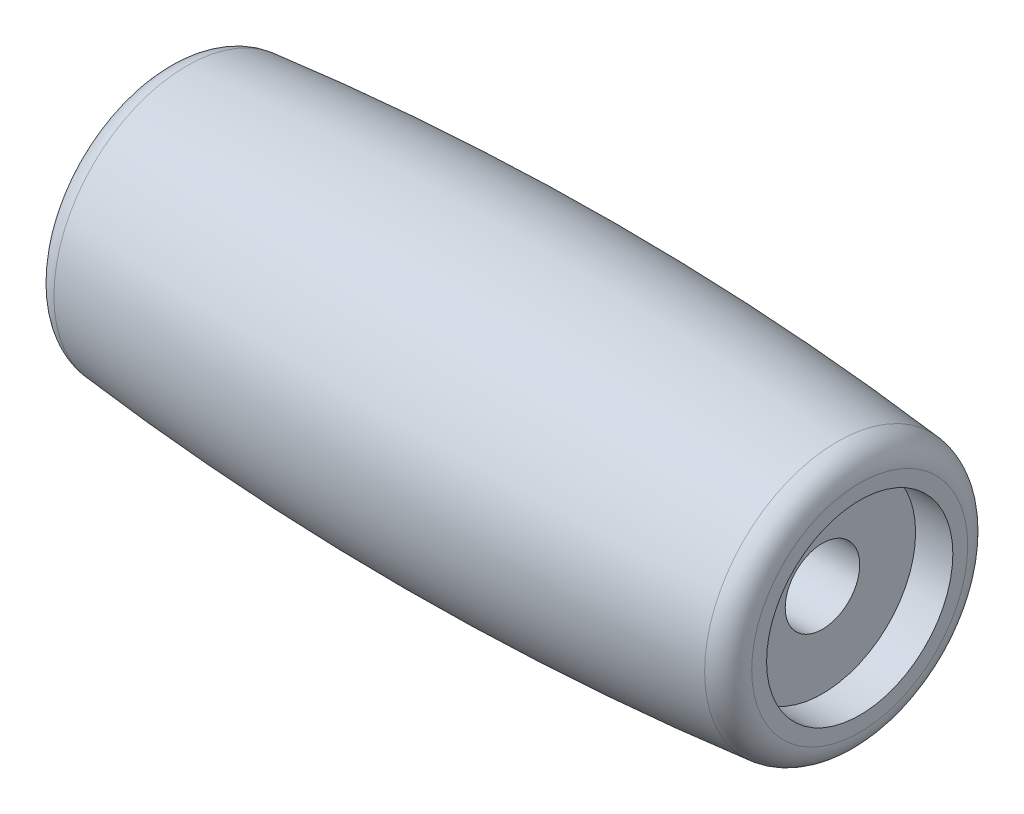
ISO-10303-21;
HEADER;
FILE_DESCRIPTION(('STEP AP214'),'2;1');
FILE_NAME('part.step','',(''),(''),'','','');
FILE_SCHEMA(('AUTOMOTIVE_DESIGN { 1 0 10303 214 1 1 1 1 }'));
ENDSEC;
DATA;
#1=APPLICATION_CONTEXT('core data for automotive mechanical design processes');
#2=APPLICATION_PROTOCOL_DEFINITION('international standard','automotive_design',2000,#1);
#3=PRODUCT_CONTEXT('',#1,'mechanical');
#4=PRODUCT('Part','Part','',(#3));
#5=PRODUCT_RELATED_PRODUCT_CATEGORY('part','',(#4));
#6=PRODUCT_DEFINITION_FORMATION('','',#4);
#7=PRODUCT_DEFINITION_CONTEXT('part definition',#1,'design');
#8=PRODUCT_DEFINITION('design','',#6,#7);
#9=PRODUCT_DEFINITION_SHAPE('','',#8);
#10=(LENGTH_UNIT() NAMED_UNIT(*) SI_UNIT(.MILLI.,.METRE.));
#11=(NAMED_UNIT(*) PLANE_ANGLE_UNIT() SI_UNIT($,.RADIAN.));
#12=(NAMED_UNIT(*) SI_UNIT($,.STERADIAN.) SOLID_ANGLE_UNIT());
#13=UNCERTAINTY_MEASURE_WITH_UNIT(LENGTH_MEASURE(1.E-05),#10,'distance_accuracy_value','');
#14=(GEOMETRIC_REPRESENTATION_CONTEXT(3) GLOBAL_UNCERTAINTY_ASSIGNED_CONTEXT((#13)) GLOBAL_UNIT_ASSIGNED_CONTEXT((#10,
#11,#12)) REPRESENTATION_CONTEXT('',''));
#15=CARTESIAN_POINT('',(0.,0.,0.));
#16=DIRECTION('',(0.,0.,1.));
#17=DIRECTION('',(1.,0.,0.));
#18=AXIS2_PLACEMENT_3D('',#15,#16,#17);
#19=CARTESIAN_POINT('',(-14.,3.75,0.));
#20=DIRECTION('',(1.,0.,0.));
#21=DIRECTION('',(0.,0.,-1.));
#22=AXIS2_PLACEMENT_3D('',#19,#20,#21);
#23=PLANE('',#22);
#24=CARTESIAN_POINT('',(-14.,0.,0.));
#25=DIRECTION('',(1.,0.,0.));
#26=DIRECTION('',(0.,0.,-1.));
#27=AXIS2_PLACEMENT_3D('',#24,#25,#26);
#28=CIRCLE('',#27,4.34857666506389);
#29=CARTESIAN_POINT('',(-14.,0.,-4.34857666506389));
#30=VERTEX_POINT('',#29);
#31=EDGE_CURVE('E10',#30,#30,#28,.F.);
#32=ORIENTED_EDGE('',*,*,#31,.T.);
#33=EDGE_LOOP('',(#32));
#34=FACE_BOUND('',#33,.T.);
#35=CARTESIAN_POINT('',(-14.,0.,0.));
#36=DIRECTION('',(-1.,0.,0.));
#37=DIRECTION('',(0.,0.,1.));
#38=AXIS2_PLACEMENT_3D('',#35,#36,#37);
#39=CIRCLE('',#38,3.75);
#40=CARTESIAN_POINT('',(-14.,0.,3.75));
#41=VERTEX_POINT('',#40);
#42=EDGE_CURVE('E76',#41,#41,#39,.T.);
#43=ORIENTED_EDGE('',*,*,#42,.F.);
#44=EDGE_LOOP('',(#43));
#45=FACE_BOUND('',#44,.T.);
#46=ADVANCED_FACE('F41',(#34,#45),#23,.F.);
#47=CARTESIAN_POINT('',(0.,0.,0.));
#48=DIRECTION('',(-1.,0.,0.));
#49=DIRECTION('',(0.,0.,1.));
#50=AXIS2_PLACEMENT_3D('',#47,#48,#49);
#51=DEGENERATE_TOROIDAL_SURFACE('',#50,125.041666666667,131.041666666667,.F.);
#52=CARTESIAN_POINT('',(13.0999679589875,0.,0.));
#53=DIRECTION('',(-1.,0.,0.));
#54=DIRECTION('',(0.,0.,1.));
#55=AXIS2_PLACEMENT_3D('',#52,#53,#54);
#56=CIRCLE('',#55,5.34356732189233);
#57=CARTESIAN_POINT('',(13.0999679589875,0.,5.34356732189233));
#58=VERTEX_POINT('',#57);
#59=EDGE_CURVE('E52',#58,#58,#56,.T.);
#60=ORIENTED_EDGE('',*,*,#59,.T.);
#61=EDGE_LOOP('',(#60));
#62=FACE_BOUND('',#61,.T.);
#63=CARTESIAN_POINT('',(-13.0999679589875,0.,0.));
#64=DIRECTION('',(1.,0.,0.));
#65=DIRECTION('',(0.,0.,-1.));
#66=AXIS2_PLACEMENT_3D('',#63,#64,#65);
#67=CIRCLE('',#66,5.34356732189233);
#68=CARTESIAN_POINT('',(-13.0999679589875,0.,-5.34356732189233));
#69=VERTEX_POINT('',#68);
#70=EDGE_CURVE('E56',#69,#69,#67,.T.);
#71=ORIENTED_EDGE('',*,*,#70,.T.);
#72=EDGE_LOOP('',(#71));
#73=FACE_BOUND('',#72,.T.);
#74=ADVANCED_FACE('F83',(#62,#73),#51,.F.);
#75=CARTESIAN_POINT('',(14.,3.75,0.));
#76=DIRECTION('',(-1.,0.,0.));
#77=DIRECTION('',(0.,0.,1.));
#78=AXIS2_PLACEMENT_3D('',#75,#76,#77);
#79=PLANE('',#78);
#80=CARTESIAN_POINT('',(14.,0.,0.));
#81=DIRECTION('',(-1.,0.,0.));
#82=DIRECTION('',(0.,0.,1.));
#83=AXIS2_PLACEMENT_3D('',#80,#81,#82);
#84=CIRCLE('',#83,4.34857666506391);
#85=CARTESIAN_POINT('',(14.,0.,4.34857666506391));
#86=VERTEX_POINT('',#85);
#87=EDGE_CURVE('E48',#86,#86,#84,.F.);
#88=ORIENTED_EDGE('',*,*,#87,.T.);
#89=EDGE_LOOP('',(#88));
#90=FACE_BOUND('',#89,.T.);
#91=CARTESIAN_POINT('',(14.,0.,0.));
#92=DIRECTION('',(-1.,0.,0.));
#93=DIRECTION('',(0.,0.,1.));
#94=AXIS2_PLACEMENT_3D('',#91,#92,#93);
#95=CIRCLE('',#94,3.75);
#96=CARTESIAN_POINT('',(14.,0.,3.75));
#97=VERTEX_POINT('',#96);
#98=EDGE_CURVE('E61',#97,#97,#95,.T.);
#99=ORIENTED_EDGE('',*,*,#98,.T.);
#100=EDGE_LOOP('',(#99));
#101=FACE_BOUND('',#100,.T.);
#102=ADVANCED_FACE('F89',(#90,#101),#79,.F.);
#103=CARTESIAN_POINT('',(0.,0.,0.));
#104=DIRECTION('',(-1.,0.,0.));
#105=DIRECTION('',(0.,0.,1.));
#106=AXIS2_PLACEMENT_3D('',#103,#104,#105);
#107=CYLINDRICAL_SURFACE('',#106,3.75);
#108=ORIENTED_EDGE('',*,*,#98,.F.);
#109=EDGE_LOOP('',(#108));
#110=FACE_BOUND('',#109,.T.);
#111=CARTESIAN_POINT('',(12.5,0.,0.));
#112=DIRECTION('',(-1.,0.,0.));
#113=DIRECTION('',(0.,0.,1.));
#114=AXIS2_PLACEMENT_3D('',#111,#112,#113);
#115=CIRCLE('',#114,3.75);
#116=CARTESIAN_POINT('',(12.5,0.,3.75));
#117=VERTEX_POINT('',#116);
#118=EDGE_CURVE('E64',#117,#117,#115,.T.);
#119=ORIENTED_EDGE('',*,*,#118,.T.);
#120=EDGE_LOOP('',(#119));
#121=FACE_BOUND('',#120,.T.);
#122=ADVANCED_FACE('F123',(#110,#121),#107,.F.);
#123=CARTESIAN_POINT('',(12.5,1.5,0.));
#124=DIRECTION('',(-1.,0.,0.));
#125=DIRECTION('',(0.,0.,1.));
#126=AXIS2_PLACEMENT_3D('',#123,#124,#125);
#127=PLANE('',#126);
#128=ORIENTED_EDGE('',*,*,#118,.F.);
#129=EDGE_LOOP('',(#128));
#130=FACE_BOUND('',#129,.T.);
#131=CARTESIAN_POINT('',(12.5,0.,0.));
#132=DIRECTION('',(-1.,0.,0.));
#133=DIRECTION('',(0.,0.,1.));
#134=AXIS2_PLACEMENT_3D('',#131,#132,#133);
#135=CIRCLE('',#134,1.5);
#136=CARTESIAN_POINT('',(12.5,0.,1.5));
#137=VERTEX_POINT('',#136);
#138=EDGE_CURVE('E67',#137,#137,#135,.T.);
#139=ORIENTED_EDGE('',*,*,#138,.T.);
#140=EDGE_LOOP('',(#139));
#141=FACE_BOUND('',#140,.T.);
#142=ADVANCED_FACE('F119',(#130,#141),#127,.F.);
#143=CARTESIAN_POINT('',(0.,0.,0.));
#144=DIRECTION('',(-1.,0.,0.));
#145=DIRECTION('',(0.,0.,1.));
#146=AXIS2_PLACEMENT_3D('',#143,#144,#145);
#147=CYLINDRICAL_SURFACE('',#146,1.5);
#148=ORIENTED_EDGE('',*,*,#138,.F.);
#149=EDGE_LOOP('',(#148));
#150=FACE_BOUND('',#149,.T.);
#151=CARTESIAN_POINT('',(-12.5,0.,0.));
#152=DIRECTION('',(-1.,0.,0.));
#153=DIRECTION('',(0.,0.,1.));
#154=AXIS2_PLACEMENT_3D('',#151,#152,#153);
#155=CIRCLE('',#154,1.5);
#156=CARTESIAN_POINT('',(-12.5,0.,1.5));
#157=VERTEX_POINT('',#156);
#158=EDGE_CURVE('E70',#157,#157,#155,.T.);
#159=ORIENTED_EDGE('',*,*,#158,.T.);
#160=EDGE_LOOP('',(#159));
#161=FACE_BOUND('',#160,.T.);
#162=ADVANCED_FACE('F112',(#150,#161),#147,.F.);
#163=CARTESIAN_POINT('',(-12.5,3.75,0.));
#164=DIRECTION('',(1.,0.,0.));
#165=DIRECTION('',(0.,0.,-1.));
#166=AXIS2_PLACEMENT_3D('',#163,#164,#165);
#167=PLANE('',#166);
#168=ORIENTED_EDGE('',*,*,#158,.F.);
#169=EDGE_LOOP('',(#168));
#170=FACE_BOUND('',#169,.T.);
#171=CARTESIAN_POINT('',(-12.5,0.,0.));
#172=DIRECTION('',(-1.,0.,0.));
#173=DIRECTION('',(0.,0.,1.));
#174=AXIS2_PLACEMENT_3D('',#171,#172,#173);
#175=CIRCLE('',#174,3.75);
#176=CARTESIAN_POINT('',(-12.5,0.,3.75));
#177=VERTEX_POINT('',#176);
#178=EDGE_CURVE('E73',#177,#177,#175,.T.);
#179=ORIENTED_EDGE('',*,*,#178,.T.);
#180=EDGE_LOOP('',(#179));
#181=FACE_BOUND('',#180,.T.);
#182=ADVANCED_FACE('F101',(#170,#181),#167,.F.);
#183=CARTESIAN_POINT('',(0.,0.,0.));
#184=DIRECTION('',(-1.,0.,0.));
#185=DIRECTION('',(0.,0.,1.));
#186=AXIS2_PLACEMENT_3D('',#183,#184,#185);
#187=CYLINDRICAL_SURFACE('',#186,3.75);
#188=ORIENTED_EDGE('',*,*,#178,.F.);
#189=EDGE_LOOP('',(#188));
#190=FACE_BOUND('',#189,.T.);
#191=ORIENTED_EDGE('',*,*,#42,.T.);
#192=EDGE_LOOP('',(#191));
#193=FACE_BOUND('',#192,.T.);
#194=ADVANCED_FACE('F80',(#190,#193),#187,.F.);
#195=CARTESIAN_POINT('',(13.,0.,0.));
#196=DIRECTION('',(-1.,0.,0.));
#197=DIRECTION('',(0.,0.,1.));
#198=AXIS2_PLACEMENT_3D('',#195,#196,#197);
#199=TOROIDAL_SURFACE('',#198,4.34857666506391,1.);
#200=ORIENTED_EDGE('',*,*,#87,.F.);
#201=EDGE_LOOP('',(#200));
#202=FACE_BOUND('',#201,.T.);
#203=ORIENTED_EDGE('',*,*,#59,.F.);
#204=EDGE_LOOP('',(#203));
#205=FACE_BOUND('',#204,.T.);
#206=ADVANCED_FACE('F93',(#202,#205),#199,.T.);
#207=CARTESIAN_POINT('',(-13.,0.,0.));
#208=DIRECTION('',(1.,0.,0.));
#209=DIRECTION('',(0.,0.,-1.));
#210=AXIS2_PLACEMENT_3D('',#207,#208,#209);
#211=TOROIDAL_SURFACE('',#210,4.34857666506389,1.);
#212=ORIENTED_EDGE('',*,*,#70,.F.);
#213=EDGE_LOOP('',(#212));
#214=FACE_BOUND('',#213,.T.);
#215=ORIENTED_EDGE('',*,*,#31,.F.);
#216=EDGE_LOOP('',(#215));
#217=FACE_BOUND('',#216,.T.);
#218=ADVANCED_FACE('F43',(#214,#217),#211,.T.);
#219=CLOSED_SHELL('',(#46,#74,#102,#122,#142,#162,#182,#194,#206,#218));
#220=MANIFOLD_SOLID_BREP('B2',#219);
#221=ADVANCED_BREP_SHAPE_REPRESENTATION('',(#18,#220),#14);
#222=SHAPE_DEFINITION_REPRESENTATION(#9,#221);
ENDSEC;
END-ISO-10303-21;
